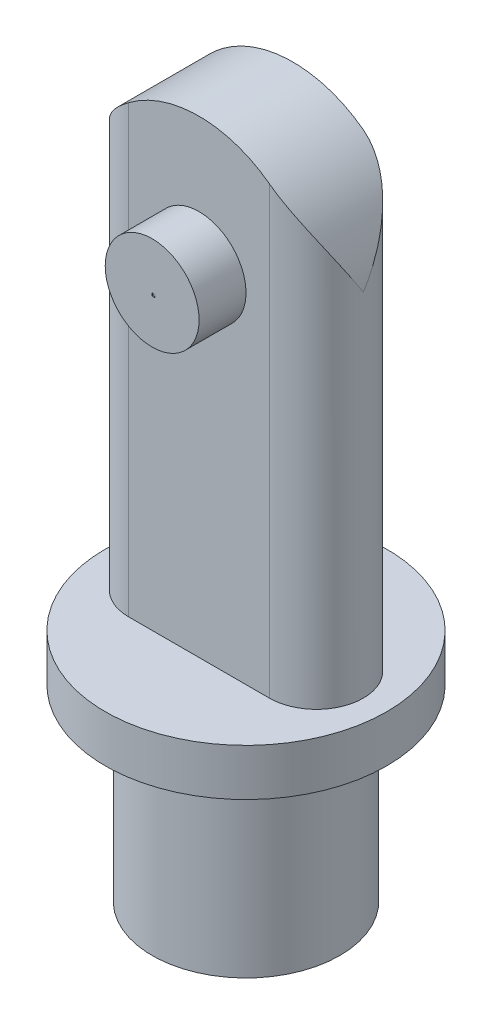
ISO-10303-21;
HEADER;
FILE_DESCRIPTION(('STEP AP214'),'2;1');
FILE_NAME('part.step','',(''),(''),'','','');
FILE_SCHEMA(('AUTOMOTIVE_DESIGN { 1 0 10303 214 1 1 1 1 }'));
ENDSEC;
DATA;
#1=APPLICATION_CONTEXT('core data for automotive mechanical design processes');
#2=APPLICATION_PROTOCOL_DEFINITION('international standard','automotive_design',2000,#1);
#3=PRODUCT_CONTEXT('',#1,'mechanical');
#4=PRODUCT('Part','Part','',(#3));
#5=PRODUCT_RELATED_PRODUCT_CATEGORY('part','',(#4));
#6=PRODUCT_DEFINITION_FORMATION('','',#4);
#7=PRODUCT_DEFINITION_CONTEXT('part definition',#1,'design');
#8=PRODUCT_DEFINITION('design','',#6,#7);
#9=PRODUCT_DEFINITION_SHAPE('','',#8);
#10=(LENGTH_UNIT() NAMED_UNIT(*) SI_UNIT(.MILLI.,.METRE.));
#11=(NAMED_UNIT(*) PLANE_ANGLE_UNIT() SI_UNIT($,.RADIAN.));
#12=(NAMED_UNIT(*) SI_UNIT($,.STERADIAN.) SOLID_ANGLE_UNIT());
#13=UNCERTAINTY_MEASURE_WITH_UNIT(LENGTH_MEASURE(1.E-05),#10,'distance_accuracy_value','');
#14=(GEOMETRIC_REPRESENTATION_CONTEXT(3) GLOBAL_UNCERTAINTY_ASSIGNED_CONTEXT((#13)) GLOBAL_UNIT_ASSIGNED_CONTEXT((#10,
#11,#12)) REPRESENTATION_CONTEXT('',''));
#15=CARTESIAN_POINT('',(0.,0.,0.));
#16=DIRECTION('',(0.,0.,1.));
#17=DIRECTION('',(1.,0.,0.));
#18=AXIS2_PLACEMENT_3D('',#15,#16,#17);
#19=CARTESIAN_POINT('',(-75.0000000000001,601.851851851852,-50.));
#20=DIRECTION('',(0.,0.,1.));
#21=DIRECTION('',(1.,0.,0.));
#22=AXIS2_PLACEMENT_3D('',#19,#20,#21);
#23=PLANE('',#22);
#24=DIRECTION('',(0.,-1.,0.));
#25=VECTOR('',#24,1.);
#26=CARTESIAN_POINT('',(-75.,601.851851851852,-50.));
#27=LINE('',#26,#25);
#28=CARTESIAN_POINT('',(-75.0000000000001,576.351851851852,-50.));
#29=VERTEX_POINT('',#28);
#30=CARTESIAN_POINT('',(-75.,101.851851851852,-50.));
#31=VERTEX_POINT('',#30);
#32=EDGE_CURVE('E217',#29,#31,#27,.T.);
#33=ORIENTED_EDGE('',*,*,#32,.F.);
#34=CARTESIAN_POINT('',(-1.66533453693773E-13,476.351851851852,-50.));
#35=DIRECTION('',(0.,0.,-1.));
#36=DIRECTION('',(1.,0.,0.));
#37=AXIS2_PLACEMENT_3D('',#34,#35,#36);
#38=CIRCLE('',#37,125.);
#39=CARTESIAN_POINT('',(75.,576.351851851852,-50.));
#40=VERTEX_POINT('',#39);
#41=EDGE_CURVE('E148',#29,#40,#38,.T.);
#42=ORIENTED_EDGE('',*,*,#41,.T.);
#43=DIRECTION('',(0.,-1.,0.));
#44=VECTOR('',#43,1.);
#45=CARTESIAN_POINT('',(74.9999999999999,601.851851851852,-50.));
#46=LINE('',#45,#44);
#47=CARTESIAN_POINT('',(75.,101.851851851852,-50.));
#48=VERTEX_POINT('',#47);
#49=EDGE_CURVE('E219',#40,#48,#46,.T.);
#50=ORIENTED_EDGE('',*,*,#49,.T.);
#51=DIRECTION('',(-1.,0.,0.));
#52=VECTOR('',#51,1.);
#53=CARTESIAN_POINT('',(-75.,101.851851851852,-50.));
#54=LINE('',#53,#52);
#55=EDGE_CURVE('E204',#48,#31,#54,.T.);
#56=ORIENTED_EDGE('',*,*,#55,.T.);
#57=EDGE_LOOP('',(#33,#42,#50,#56));
#58=FACE_BOUND('',#57,.T.);
#59=ADVANCED_FACE('F35',(#58),#23,.F.);
#60=CARTESIAN_POINT('',(-75.0000000000001,601.851851851852,50.));
#61=DIRECTION('',(0.,0.,-1.));
#62=DIRECTION('',(-1.,0.,0.));
#63=AXIS2_PLACEMENT_3D('',#60,#61,#62);
#64=PLANE('',#63);
#65=CARTESIAN_POINT('',(0.,463.3,50.));
#66=DIRECTION('',(0.,0.,-1.));
#67=DIRECTION('',(-1.,0.,0.));
#68=AXIS2_PLACEMENT_3D('',#65,#66,#67);
#69=CIRCLE('',#68,50.);
#70=CARTESIAN_POINT('',(-50.,463.3,50.));
#71=VERTEX_POINT('',#70);
#72=EDGE_CURVE('E11',#71,#71,#69,.F.);
#73=ORIENTED_EDGE('',*,*,#72,.F.);
#74=EDGE_LOOP('',(#73));
#75=FACE_BOUND('',#74,.T.);
#76=DIRECTION('',(0.,-1.,0.));
#77=VECTOR('',#76,1.);
#78=CARTESIAN_POINT('',(74.9999999999999,601.851851851852,50.));
#79=LINE('',#78,#77);
#80=CARTESIAN_POINT('',(75.,576.351851851852,50.));
#81=VERTEX_POINT('',#80);
#82=CARTESIAN_POINT('',(75.,101.851851851852,50.));
#83=VERTEX_POINT('',#82);
#84=EDGE_CURVE('E213',#81,#83,#79,.T.);
#85=ORIENTED_EDGE('',*,*,#84,.F.);
#86=CARTESIAN_POINT('',(-1.66533453693773E-13,476.351851851852,50.));
#87=DIRECTION('',(0.,0.,-1.));
#88=DIRECTION('',(1.,0.,0.));
#89=AXIS2_PLACEMENT_3D('',#86,#87,#88);
#90=CIRCLE('',#89,125.);
#91=CARTESIAN_POINT('',(-75.0000000000001,576.351851851852,50.));
#92=VERTEX_POINT('',#91);
#93=EDGE_CURVE('E147',#92,#81,#90,.T.);
#94=ORIENTED_EDGE('',*,*,#93,.F.);
#95=DIRECTION('',(0.,-1.,0.));
#96=VECTOR('',#95,1.);
#97=CARTESIAN_POINT('',(-75.0000000000001,601.851851851852,50.));
#98=LINE('',#97,#96);
#99=CARTESIAN_POINT('',(-75.,101.851851851852,50.));
#100=VERTEX_POINT('',#99);
#101=EDGE_CURVE('E215',#92,#100,#98,.T.);
#102=ORIENTED_EDGE('',*,*,#101,.T.);
#103=DIRECTION('',(1.,0.,0.));
#104=VECTOR('',#103,1.);
#105=CARTESIAN_POINT('',(-75.,101.851851851852,50.));
#106=LINE('',#105,#104);
#107=EDGE_CURVE('E210',#100,#83,#106,.T.);
#108=ORIENTED_EDGE('',*,*,#107,.T.);
#109=EDGE_LOOP('',(#85,#94,#102,#108));
#110=FACE_BOUND('',#109,.T.);
#111=ADVANCED_FACE('F176',(#75,#110),#64,.F.);
#112=CARTESIAN_POINT('',(0.,101.851851851852,0.));
#113=DIRECTION('',(0.,-1.,0.));
#114=DIRECTION('',(1.,0.,0.));
#115=AXIS2_PLACEMENT_3D('',#112,#113,#114);
#116=PLANE('',#115);
#117=CARTESIAN_POINT('',(0.,101.851851851852,0.));
#118=DIRECTION('',(0.,1.,0.));
#119=DIRECTION('',(-1.,0.,0.));
#120=AXIS2_PLACEMENT_3D('',#117,#118,#119);
#121=CIRCLE('',#120,150.);
#122=CARTESIAN_POINT('',(-150.,101.851851851852,0.));
#123=VERTEX_POINT('',#122);
#124=EDGE_CURVE('E221',#123,#123,#121,.T.);
#125=ORIENTED_EDGE('',*,*,#124,.T.);
#126=EDGE_LOOP('',(#125));
#127=FACE_BOUND('',#126,.T.);
#128=CARTESIAN_POINT('',(75.,101.851851851852,0.));
#129=DIRECTION('',(0.,1.,0.));
#130=DIRECTION('',(-1.,0.,0.));
#131=AXIS2_PLACEMENT_3D('',#128,#129,#130);
#132=CIRCLE('',#131,50.);
#133=EDGE_CURVE('E201',#83,#48,#132,.T.);
#134=ORIENTED_EDGE('',*,*,#133,.F.);
#135=ORIENTED_EDGE('',*,*,#107,.F.);
#136=CARTESIAN_POINT('',(-75.,101.851851851852,0.));
#137=DIRECTION('',(0.,1.,0.));
#138=DIRECTION('',(-1.,0.,0.));
#139=AXIS2_PLACEMENT_3D('',#136,#137,#138);
#140=CIRCLE('',#139,50.);
#141=EDGE_CURVE('E207',#31,#100,#140,.T.);
#142=ORIENTED_EDGE('',*,*,#141,.F.);
#143=ORIENTED_EDGE('',*,*,#55,.F.);
#144=EDGE_LOOP('',(#134,#135,#142,#143));
#145=FACE_BOUND('',#144,.T.);
#146=ADVANCED_FACE('F37',(#127,#145),#116,.F.);
#147=CARTESIAN_POINT('',(0.,-148.148148148148,0.));
#148=DIRECTION('',(0.,1.,0.));
#149=DIRECTION('',(-1.,0.,0.));
#150=AXIS2_PLACEMENT_3D('',#147,#148,#149);
#151=PLANE('',#150);
#152=CARTESIAN_POINT('',(0.,-148.148148148148,0.));
#153=DIRECTION('',(0.,1.,0.));
#154=DIRECTION('',(-1.,0.,0.));
#155=AXIS2_PLACEMENT_3D('',#152,#153,#154);
#156=CIRCLE('',#155,100.);
#157=CARTESIAN_POINT('',(-100.,-148.148148148148,0.));
#158=VERTEX_POINT('',#157);
#159=EDGE_CURVE('E43',#158,#158,#156,.T.);
#160=ORIENTED_EDGE('',*,*,#159,.F.);
#161=EDGE_LOOP('',(#160));
#162=FACE_BOUND('',#161,.T.);
#163=ADVANCED_FACE('F234',(#162),#151,.F.);
#164=CARTESIAN_POINT('',(0.,101.851851851852,0.));
#165=DIRECTION('',(0.,1.,0.));
#166=DIRECTION('',(-1.,0.,0.));
#167=AXIS2_PLACEMENT_3D('',#164,#165,#166);
#168=CYLINDRICAL_SURFACE('',#167,100.);
#169=CARTESIAN_POINT('',(0.,51.8518518518519,0.));
#170=DIRECTION('',(0.,1.,0.));
#171=DIRECTION('',(-1.,0.,0.));
#172=AXIS2_PLACEMENT_3D('',#169,#170,#171);
#173=CIRCLE('',#172,100.);
#174=CARTESIAN_POINT('',(-100.,51.8518518518519,0.));
#175=VERTEX_POINT('',#174);
#176=EDGE_CURVE('E227',#175,#175,#173,.T.);
#177=ORIENTED_EDGE('',*,*,#176,.F.);
#178=EDGE_LOOP('',(#177));
#179=FACE_BOUND('',#178,.T.);
#180=ORIENTED_EDGE('',*,*,#159,.T.);
#181=EDGE_LOOP('',(#180));
#182=FACE_BOUND('',#181,.T.);
#183=ADVANCED_FACE('F232',(#179,#182),#168,.T.);
#184=CARTESIAN_POINT('',(0.,51.8518518518519,0.));
#185=DIRECTION('',(0.,1.,0.));
#186=DIRECTION('',(-1.,0.,0.));
#187=AXIS2_PLACEMENT_3D('',#184,#185,#186);
#188=PLANE('',#187);
#189=CARTESIAN_POINT('',(0.,51.8518518518519,0.));
#190=DIRECTION('',(0.,1.,0.));
#191=DIRECTION('',(-1.,0.,0.));
#192=AXIS2_PLACEMENT_3D('',#189,#190,#191);
#193=CIRCLE('',#192,150.);
#194=CARTESIAN_POINT('',(-150.,51.8518518518519,0.));
#195=VERTEX_POINT('',#194);
#196=EDGE_CURVE('E224',#195,#195,#193,.T.);
#197=ORIENTED_EDGE('',*,*,#196,.F.);
#198=EDGE_LOOP('',(#197));
#199=FACE_BOUND('',#198,.T.);
#200=ORIENTED_EDGE('',*,*,#176,.T.);
#201=EDGE_LOOP('',(#200));
#202=FACE_BOUND('',#201,.T.);
#203=ADVANCED_FACE('F240',(#199,#202),#188,.F.);
#204=CARTESIAN_POINT('',(0.,101.851851851852,0.));
#205=DIRECTION('',(0.,1.,0.));
#206=DIRECTION('',(-1.,0.,0.));
#207=AXIS2_PLACEMENT_3D('',#204,#205,#206);
#208=CYLINDRICAL_SURFACE('',#207,150.);
#209=ORIENTED_EDGE('',*,*,#124,.F.);
#210=EDGE_LOOP('',(#209));
#211=FACE_BOUND('',#210,.T.);
#212=ORIENTED_EDGE('',*,*,#196,.T.);
#213=EDGE_LOOP('',(#212));
#214=FACE_BOUND('',#213,.T.);
#215=ADVANCED_FACE('F184',(#211,#214),#208,.T.);
#216=CARTESIAN_POINT('',(74.9999999999999,601.851851851852,0.));
#217=DIRECTION('',(0.,-1.,0.));
#218=DIRECTION('',(1.,0.,0.));
#219=AXIS2_PLACEMENT_3D('',#216,#217,#218);
#220=CYLINDRICAL_SURFACE('',#219,50.);
#221=ORIENTED_EDGE('',*,*,#49,.F.);
#222=CARTESIAN_POINT('',(74.9999999999999,576.351851851852,-50.));
#223=CARTESIAN_POINT('',(75.8548876916507,575.710722113704,-49.9999948188799));
#224=CARTESIAN_POINT('',(76.7014274211317,575.058654268094,-49.9780765631765));
#225=CARTESIAN_POINT('',(78.3760689163359,573.73423865997,-49.892935402162));
#226=CARTESIAN_POINT('',(79.2041749649826,573.061895695542,-49.8297221972158));
#227=CARTESIAN_POINT('',(80.8392312522473,571.699372628851,-49.664649470072));
#228=CARTESIAN_POINT('',(81.6462147883487,571.009224492328,-49.5628552487716));
#229=CARTESIAN_POINT('',(83.2393184013008,569.61137825138,-49.3230431476915));
#230=CARTESIAN_POINT('',(84.0254371597703,568.903679043396,-49.1850229848776));
#231=CARTESIAN_POINT('',(86.3361426340374,566.769968119452,-48.7231335746528));
#232=CARTESIAN_POINT('',(87.8290522518446,565.32000726162,-48.3497276675414));
#233=CARTESIAN_POINT('',(90.7250700647491,562.364910884924,-47.4869151179881));
#234=CARTESIAN_POINT('',(92.12812501792,560.859743469921,-46.9974404940054));
#235=CARTESIAN_POINT('',(94.4508996102789,558.242917214034,-46.0732408701906));
#236=CARTESIAN_POINT('',(95.3935241065153,557.142656923038,-45.6632914849911));
#237=CARTESIAN_POINT('',(97.2315765482262,554.92092440906,-44.7972015171445));
#238=CARTESIAN_POINT('',(98.1270003832501,553.799450350205,-44.341056921677));
#239=CARTESIAN_POINT('',(99.8707035667538,551.537504091322,-43.3870481282598));
#240=CARTESIAN_POINT('',(100.718974965325,550.397028729546,-42.8891769304691));
#241=CARTESIAN_POINT('',(102.368475154347,548.099293456338,-41.8558679971967));
#242=CARTESIAN_POINT('',(103.169704905388,546.942033888242,-41.3204310292979));
#243=CARTESIAN_POINT('',(104.729996272933,544.605878603508,-40.2125355116866));
#244=CARTESIAN_POINT('',(105.488791970012,543.426897237797,-39.6398836191794));
#245=CARTESIAN_POINT('',(106.959799421763,541.055393556719,-38.4637234241809));
#246=CARTESIAN_POINT('',(107.672011338206,539.862871288393,-37.8602152288557));
#247=CARTESIAN_POINT('',(109.050451126487,537.465766771549,-36.6254411262698));
#248=CARTESIAN_POINT('',(109.716680379267,536.261184886447,-35.9941760535299));
#249=CARTESIAN_POINT('',(111.003843506792,533.841199966037,-34.7066549266096));
#250=CARTESIAN_POINT('',(111.624775326797,532.62579644265,-34.0503977408124));
#251=CARTESIAN_POINT('',(113.070177723058,529.679438235681,-32.4387160224578));
#252=CARTESIAN_POINT('',(113.87231595725,527.943632790594,-31.4720514804099));
#253=CARTESIAN_POINT('',(115.389098466878,524.455626763471,-29.500304415542));
#254=CARTESIAN_POINT('',(116.103735360396,522.703424811573,-28.4952186607473));
#255=CARTESIAN_POINT('',(117.447486065346,519.184509399077,-26.4519686967095));
#256=CARTESIAN_POINT('',(118.07656345093,517.417790095221,-25.4137906295771));
#257=CARTESIAN_POINT('',(119.250401058601,513.872884008757,-23.3099332588211));
#258=CARTESIAN_POINT('',(119.795163641773,512.094697548718,-22.2442547262744));
#259=CARTESIAN_POINT('',(120.800792857726,508.532387475672,-20.092167793122));
#260=CARTESIAN_POINT('',(121.261826029635,506.748282997878,-19.0058053984205));
#261=CARTESIAN_POINT('',(122.102559806865,503.172338714624,-16.8144606164184));
#262=CARTESIAN_POINT('',(122.482258584527,501.380498736262,-15.7094778113012));
#263=CARTESIAN_POINT('',(123.161140751832,497.791692821242,-13.485387555063));
#264=CARTESIAN_POINT('',(123.460365987055,495.994730041599,-12.3662877628446));
#265=CARTESIAN_POINT('',(123.979339914542,492.396393621469,-10.1171219834834));
#266=CARTESIAN_POINT('',(124.1990939517,490.595020285824,-8.98705673908128));
#267=CARTESIAN_POINT('',(124.585601476667,486.730683380824,-6.55678689467915));
#268=CARTESIAN_POINT('',(124.740240814421,484.667239313518,-5.25541577054701));
#269=CARTESIAN_POINT('',(124.946904000051,480.539652669551,-2.64858068164321));
#270=CARTESIAN_POINT('',(124.998999059404,478.47551157395,-1.34312018816991));
#271=CARTESIAN_POINT('',(124.99999523736,476.391692782867,-0.0251976174018483));
#272=CARTESIAN_POINT('',(124.999999999237,476.371772305462,-0.0125988011475533));
#273=CARTESIAN_POINT('',(125.,476.351851851852,0.));
#274=B_SPLINE_CURVE_WITH_KNOTS('',3,(#222,#223,#224,#225,#226,#227,#228,#229,#230,#231,#232,
#233,#234,#235,#236,#237,#238,#239,#240,#241,#242,#243,#244,#245,#246,#247,#248,#249,#250,#251,
#252,#253,#254,#255,#256,#257,#258,#259,#260,#261,#262,#263,#264,#265,#266,#267,#268,#269,#270,
#271,#272,#273),.UNSPECIFIED.,.F.,.F.,(4,2,2,2,2,2,2,2,2,2,2,2,2,2,2,2,2,2,2,2,2,2,2,2,2,4),(0.,
3.20527938884933,6.40980611410545,9.60893301588431,12.808261581738,19.1444755624169,
25.4844098752057,29.9999920654819,34.5159668459693,39.0327007254524,43.5493423411897,
48.0916873504894,52.6340165849582,57.176209345869,61.7186080176362,68.1440747392081,
74.5700831626554,80.9988188687545,87.4273745170106,93.8430001795978,100.258769992229,
106.671197178534,113.083193012112,120.414389720974,127.740493509952,127.811204189514),.UNSPECIFIED.);
#275=CARTESIAN_POINT('',(125.,476.351851851852,0.));
#276=VERTEX_POINT('',#275);
#277=EDGE_CURVE('E194',#40,#276,#274,.T.);
#278=ORIENTED_EDGE('',*,*,#277,.T.);
#279=CARTESIAN_POINT('',(74.9999999999999,576.351851851852,50.));
#280=CARTESIAN_POINT('',(75.8548876916507,575.710722113704,49.9999948188799));
#281=CARTESIAN_POINT('',(76.7014274211316,575.058654268094,49.9780765631765));
#282=CARTESIAN_POINT('',(78.3760689163358,573.73423865997,49.892935402162));
#283=CARTESIAN_POINT('',(79.2041749649825,573.061895695542,49.8297221972158));
#284=CARTESIAN_POINT('',(80.8392312522472,571.699372628851,49.664649470072));
#285=CARTESIAN_POINT('',(81.6462147883487,571.009224492328,49.5628552487716));
#286=CARTESIAN_POINT('',(83.2393184013009,569.61137825138,49.3230431476915));
#287=CARTESIAN_POINT('',(84.0254371597704,568.903679043396,49.1850229848776));
#288=CARTESIAN_POINT('',(86.3361426340374,566.769968119452,48.7231335746528));
#289=CARTESIAN_POINT('',(87.8290522518446,565.32000726162,48.3497276675414));
#290=CARTESIAN_POINT('',(90.7250700647491,562.364910884924,47.4869151179881));
#291=CARTESIAN_POINT('',(92.12812501792,560.859743469921,46.9974404940054));
#292=CARTESIAN_POINT('',(94.4508996102789,558.242917214034,46.0732408701906));
#293=CARTESIAN_POINT('',(95.3935241065153,557.142656923038,45.6632914849911));
#294=CARTESIAN_POINT('',(97.2315765482262,554.92092440906,44.7972015171445));
#295=CARTESIAN_POINT('',(98.12700038325,553.799450350205,44.341056921677));
#296=CARTESIAN_POINT('',(99.8707035667538,551.537504091322,43.3870481282598));
#297=CARTESIAN_POINT('',(100.718974965325,550.397028729546,42.8891769304691));
#298=CARTESIAN_POINT('',(102.368475154347,548.099293456338,41.8558679971967));
#299=CARTESIAN_POINT('',(103.169704905388,546.942033888242,41.3204310292979));
#300=CARTESIAN_POINT('',(104.729996272933,544.605878603508,40.2125355116866));
#301=CARTESIAN_POINT('',(105.488791970012,543.426897237797,39.6398836191794));
#302=CARTESIAN_POINT('',(106.959799421763,541.055393556719,38.4637234241809));
#303=CARTESIAN_POINT('',(107.672011338206,539.862871288393,37.8602152288557));
#304=CARTESIAN_POINT('',(109.050451126487,537.465766771549,36.6254411262698));
#305=CARTESIAN_POINT('',(109.716680379267,536.261184886447,35.9941760535299));
#306=CARTESIAN_POINT('',(111.003843506792,533.841199966037,34.7066549266096));
#307=CARTESIAN_POINT('',(111.624775326797,532.62579644265,34.0503977408124));
#308=CARTESIAN_POINT('',(113.070177723058,529.679438235681,32.4387160224578));
#309=CARTESIAN_POINT('',(113.87231595725,527.943632790594,31.4720514804099));
#310=CARTESIAN_POINT('',(115.389098466878,524.455626763471,29.500304415542));
#311=CARTESIAN_POINT('',(116.103735360396,522.703424811573,28.4952186607473));
#312=CARTESIAN_POINT('',(117.447486065346,519.184509399077,26.4519686967095));
#313=CARTESIAN_POINT('',(118.07656345093,517.417790095221,25.4137906295771));
#314=CARTESIAN_POINT('',(119.250401058601,513.872884008757,23.3099332588211));
#315=CARTESIAN_POINT('',(119.795163641773,512.094697548718,22.2442547262744));
#316=CARTESIAN_POINT('',(120.800792857726,508.532387475672,20.092167793122));
#317=CARTESIAN_POINT('',(121.261826029635,506.748282997878,19.0058053984205));
#318=CARTESIAN_POINT('',(122.102559806865,503.172338714624,16.8144606164184));
#319=CARTESIAN_POINT('',(122.482258584527,501.380498736262,15.7094778113012));
#320=CARTESIAN_POINT('',(123.161140751832,497.791692821242,13.485387555063));
#321=CARTESIAN_POINT('',(123.460365987055,495.994730041599,12.3662877628446));
#322=CARTESIAN_POINT('',(123.979339914542,492.396393621469,10.1171219834834));
#323=CARTESIAN_POINT('',(124.1990939517,490.595020285824,8.98705673908128));
#324=CARTESIAN_POINT('',(124.585601476667,486.730683380824,6.55678689467915));
#325=CARTESIAN_POINT('',(124.740240814421,484.667239313518,5.25541577054701));
#326=CARTESIAN_POINT('',(124.946904000051,480.539652669551,2.64858068164321));
#327=CARTESIAN_POINT('',(124.998999059404,478.47551157395,1.34312018816991));
#328=CARTESIAN_POINT('',(124.99999523736,476.391692782867,0.0251976174018483));
#329=CARTESIAN_POINT('',(124.999999999237,476.371772305462,0.0125988011475533));
#330=CARTESIAN_POINT('',(125.,476.351851851852,0.));
#331=B_SPLINE_CURVE_WITH_KNOTS('',3,(#279,#280,#281,#282,#283,#284,#285,#286,#287,#288,#289,
#290,#291,#292,#293,#294,#295,#296,#297,#298,#299,#300,#301,#302,#303,#304,#305,#306,#307,#308,
#309,#310,#311,#312,#313,#314,#315,#316,#317,#318,#319,#320,#321,#322,#323,#324,#325,#326,#327,
#328,#329,#330),.UNSPECIFIED.,.F.,.F.,(4,2,2,2,2,2,2,2,2,2,2,2,2,2,2,2,2,2,2,2,2,2,2,2,2,4),(0.,
3.20527938884929,6.40980611410538,9.60893301588433,12.808261581738,19.144475562417,
25.4844098752057,29.9999920654819,34.5159668459693,39.0327007254524,43.5493423411897,
48.0916873504894,52.6340165849582,57.176209345869,61.7186080176362,68.1440747392081,
74.5700831626554,80.9988188687544,87.4273745170106,93.8430001795978,100.258769992229,
106.671197178534,113.083193012112,120.414389720974,127.740493509952,127.811204189514),.UNSPECIFIED.);
#332=EDGE_CURVE('E188',#276,#81,#331,.F.);
#333=ORIENTED_EDGE('',*,*,#332,.T.);
#334=ORIENTED_EDGE('',*,*,#84,.T.);
#335=ORIENTED_EDGE('',*,*,#133,.T.);
#336=EDGE_LOOP('',(#221,#278,#333,#334,#335));
#337=FACE_BOUND('',#336,.T.);
#338=ADVANCED_FACE('F174',(#337),#220,.T.);
#339=CARTESIAN_POINT('',(-75.0000000000001,601.851851851852,0.));
#340=DIRECTION('',(0.,-1.,0.));
#341=DIRECTION('',(1.,0.,0.));
#342=AXIS2_PLACEMENT_3D('',#339,#340,#341);
#343=CYLINDRICAL_SURFACE('',#342,50.);
#344=ORIENTED_EDGE('',*,*,#101,.F.);
#345=CARTESIAN_POINT('',(-75.0000000000001,576.351851851852,50.));
#346=CARTESIAN_POINT('',(-75.8548876916703,575.71072211369,49.9999948188799));
#347=CARTESIAN_POINT('',(-76.7014274211702,575.058654268064,49.9780765631755));
#348=CARTESIAN_POINT('',(-78.3760689164117,573.734238659909,49.8929354021572));
#349=CARTESIAN_POINT('',(-79.2041749650765,573.061895695465,49.8297221972082));
#350=CARTESIAN_POINT('',(-80.8392312523763,571.699372628742,49.6646494700571));
#351=CARTESIAN_POINT('',(-81.6462147884946,571.009224492203,49.5628552487523));
#352=CARTESIAN_POINT('',(-83.2393184014795,569.611378251221,49.323043147662));
#353=CARTESIAN_POINT('',(-84.0254371599649,568.90367904322,49.1850229848422));
#354=CARTESIAN_POINT('',(-86.3361426342083,566.769968119288,48.7231335746119));
#355=CARTESIAN_POINT('',(-87.8290522519782,565.320007261487,48.3497276675048));
#356=CARTESIAN_POINT('',(-90.7250700648127,562.364910884856,47.4869151179659));
#357=CARTESIAN_POINT('',(-92.1281250179508,560.859743469886,46.9974404939931));
#358=CARTESIAN_POINT('',(-94.450899610267,558.242917214048,46.0732408701954));
#359=CARTESIAN_POINT('',(-95.393524106492,557.142656923065,45.6632914850013));
#360=CARTESIAN_POINT('',(-97.2315765481813,554.920924409116,44.7972015171665));
#361=CARTESIAN_POINT('',(-98.1270003831949,553.799450350275,44.3410569217056));
#362=CARTESIAN_POINT('',(-99.8707035666788,551.537504091421,43.3870481283025));
#363=CARTESIAN_POINT('',(-100.718974965241,550.397028729661,42.8891769305195));
#364=CARTESIAN_POINT('',(-102.368475154245,548.099293456484,41.8558679972633));
#365=CARTESIAN_POINT('',(-103.169704905278,546.942033888404,41.320431029373));
#366=CARTESIAN_POINT('',(-104.729996272827,544.605878603672,40.2125355117656));
#367=CARTESIAN_POINT('',(-105.488791969917,543.426897237947,39.639883619253));
#368=CARTESIAN_POINT('',(-106.959799421689,541.055393556842,38.4637234242428));
#369=CARTESIAN_POINT('',(-107.672011338142,539.862871288502,37.8602152289114));
#370=CARTESIAN_POINT('',(-109.050451126443,537.465766771629,36.6254411263114));
#371=CARTESIAN_POINT('',(-109.716680379232,536.261184886512,35.9941760535636));
#372=CARTESIAN_POINT('',(-111.003843506776,533.84119996607,34.706654926627));
#373=CARTESIAN_POINT('',(-111.624775326789,532.625796442667,34.0503977408212));
#374=CARTESIAN_POINT('',(-113.070177723067,529.679438235664,32.4387160224482));
#375=CARTESIAN_POINT('',(-113.872315957266,527.943632790558,31.4720514803901));
#376=CARTESIAN_POINT('',(-115.389098466909,524.4556267634,29.5003044155012));
#377=CARTESIAN_POINT('',(-116.103735360433,522.703424811485,28.4952186606957));
#378=CARTESIAN_POINT('',(-117.447486065391,519.184509398957,26.4519686966389));
#379=CARTESIAN_POINT('',(-118.076563450977,517.417790095087,25.4137906294983));
#380=CARTESIAN_POINT('',(-119.250401058652,513.872884008595,23.3099332587232));
#381=CARTESIAN_POINT('',(-119.795163641826,512.094697548543,22.2442547261655));
#382=CARTESIAN_POINT('',(-120.800792857773,508.532387475496,20.092167793018));
#383=CARTESIAN_POINT('',(-121.261826029674,506.748282997716,19.0058053983328));
#384=CARTESIAN_POINT('',(-122.102559806892,503.172338714508,16.8144606163347));
#385=CARTESIAN_POINT('',(-122.482258584548,501.38049873618,15.7094778112053));
#386=CARTESIAN_POINT('',(-123.161140751844,497.791692821154,13.4853875550521));
#387=CARTESIAN_POINT('',(-123.460365987063,495.99473004147,12.3662877629309));
#388=CARTESIAN_POINT('',(-123.979339914545,492.39639362152,10.1171219833468));
#389=CARTESIAN_POINT('',(-124.199093951701,490.595020286096,8.98705673862461));
#390=CARTESIAN_POINT('',(-124.585601476667,486.730683380503,6.55678689519211));
#391=CARTESIAN_POINT('',(-124.740240814421,484.667239312233,5.25541577258816));
#392=CARTESIAN_POINT('',(-124.946904000051,480.539652670846,2.64858067960428));
#393=CARTESIAN_POINT('',(-124.998999059405,478.475511578786,1.34312018052764));
#394=CARTESIAN_POINT('',(-124.99999523736,476.39169278296,0.0251976172548661));
#395=CARTESIAN_POINT('',(-124.999999999237,476.371772305509,0.0125988010734479));
#396=CARTESIAN_POINT('',(-125.,476.351851851852,0.));
#397=B_SPLINE_CURVE_WITH_KNOTS('',3,(#345,#346,#347,#348,#349,#350,#351,#352,#353,#354,#355,
#356,#357,#358,#359,#360,#361,#362,#363,#364,#365,#366,#367,#368,#369,#370,#371,#372,#373,#374,
#375,#376,#377,#378,#379,#380,#381,#382,#383,#384,#385,#386,#387,#388,#389,#390,#391,#392,#393,
#394,#395,#396),.UNSPECIFIED.,.F.,.F.,(4,2,2,2,2,2,2,2,2,2,2,2,2,2,2,2,2,2,2,2,2,2,2,2,2,4),(0.,
3.20527938892213,6.40980611425107,9.60893301610141,12.8082615820264,19.1444755625606,
25.4844098752058,29.9999920654259,34.5159668458572,39.0327007252819,43.5493423409609,
48.0916873503149,52.6340165848381,57.1762093458088,61.718608017636,68.1440747392741,
74.570083162786,80.9988188689336,87.4273745172409,93.8430001797652,100.258769992329,
106.671197178579,113.08319301211,120.414389720968,127.740493509952,127.811204189514),.UNSPECIFIED.);
#398=CARTESIAN_POINT('',(-125.,476.351851851852,0.));
#399=VERTEX_POINT('',#398);
#400=EDGE_CURVE('E58',#92,#399,#397,.T.);
#401=ORIENTED_EDGE('',*,*,#400,.T.);
#402=CARTESIAN_POINT('',(-75.0000000000001,576.351851851852,-50.));
#403=CARTESIAN_POINT('',(-75.8548876916703,575.71072211369,-49.9999948188799));
#404=CARTESIAN_POINT('',(-76.7014274211702,575.058654268064,-49.9780765631755));
#405=CARTESIAN_POINT('',(-78.3760689164117,573.734238659909,-49.8929354021572));
#406=CARTESIAN_POINT('',(-79.2041749650765,573.061895695465,-49.8297221972082));
#407=CARTESIAN_POINT('',(-80.8392312523763,571.699372628742,-49.6646494700571));
#408=CARTESIAN_POINT('',(-81.6462147884946,571.009224492203,-49.5628552487523));
#409=CARTESIAN_POINT('',(-83.2393184014795,569.611378251221,-49.323043147662));
#410=CARTESIAN_POINT('',(-84.0254371599649,568.90367904322,-49.1850229848422));
#411=CARTESIAN_POINT('',(-86.3361426342083,566.769968119288,-48.7231335746119));
#412=CARTESIAN_POINT('',(-87.8290522519782,565.320007261487,-48.3497276675048));
#413=CARTESIAN_POINT('',(-90.7250700648127,562.364910884856,-47.4869151179659));
#414=CARTESIAN_POINT('',(-92.1281250179508,560.859743469886,-46.9974404939931));
#415=CARTESIAN_POINT('',(-94.450899610267,558.242917214048,-46.0732408701954));
#416=CARTESIAN_POINT('',(-95.393524106492,557.142656923065,-45.6632914850013));
#417=CARTESIAN_POINT('',(-97.2315765481813,554.920924409116,-44.7972015171665));
#418=CARTESIAN_POINT('',(-98.1270003831949,553.799450350275,-44.3410569217056));
#419=CARTESIAN_POINT('',(-99.8707035666788,551.537504091421,-43.3870481283025));
#420=CARTESIAN_POINT('',(-100.718974965241,550.397028729661,-42.8891769305195));
#421=CARTESIAN_POINT('',(-102.368475154245,548.099293456484,-41.8558679972633));
#422=CARTESIAN_POINT('',(-103.169704905278,546.942033888404,-41.320431029373));
#423=CARTESIAN_POINT('',(-104.729996272827,544.605878603672,-40.2125355117656));
#424=CARTESIAN_POINT('',(-105.488791969917,543.426897237947,-39.639883619253));
#425=CARTESIAN_POINT('',(-106.959799421689,541.055393556842,-38.4637234242428));
#426=CARTESIAN_POINT('',(-107.672011338142,539.862871288502,-37.8602152289114));
#427=CARTESIAN_POINT('',(-109.050451126443,537.465766771629,-36.6254411263114));
#428=CARTESIAN_POINT('',(-109.716680379232,536.261184886512,-35.9941760535636));
#429=CARTESIAN_POINT('',(-111.003843506776,533.84119996607,-34.706654926627));
#430=CARTESIAN_POINT('',(-111.624775326789,532.625796442667,-34.0503977408212));
#431=CARTESIAN_POINT('',(-113.070177723067,529.679438235664,-32.4387160224482));
#432=CARTESIAN_POINT('',(-113.872315957266,527.943632790558,-31.4720514803901));
#433=CARTESIAN_POINT('',(-115.389098466909,524.4556267634,-29.5003044155012));
#434=CARTESIAN_POINT('',(-116.103735360433,522.703424811485,-28.4952186606957));
#435=CARTESIAN_POINT('',(-117.447486065391,519.184509398957,-26.4519686966389));
#436=CARTESIAN_POINT('',(-118.076563450977,517.417790095087,-25.4137906294983));
#437=CARTESIAN_POINT('',(-119.250401058652,513.872884008595,-23.3099332587232));
#438=CARTESIAN_POINT('',(-119.795163641826,512.094697548543,-22.2442547261655));
#439=CARTESIAN_POINT('',(-120.800792857773,508.532387475496,-20.092167793018));
#440=CARTESIAN_POINT('',(-121.261826029674,506.748282997716,-19.0058053983328));
#441=CARTESIAN_POINT('',(-122.102559806892,503.172338714508,-16.8144606163347));
#442=CARTESIAN_POINT('',(-122.482258584548,501.38049873618,-15.7094778112053));
#443=CARTESIAN_POINT('',(-123.161140751844,497.791692821154,-13.4853875550521));
#444=CARTESIAN_POINT('',(-123.460365987063,495.99473004147,-12.3662877629309));
#445=CARTESIAN_POINT('',(-123.979339914545,492.39639362152,-10.1171219833468));
#446=CARTESIAN_POINT('',(-124.199093951701,490.595020286096,-8.98705673862461));
#447=CARTESIAN_POINT('',(-124.585601476667,486.730683380503,-6.55678689519211));
#448=CARTESIAN_POINT('',(-124.740240814421,484.667239312233,-5.25541577258816));
#449=CARTESIAN_POINT('',(-124.946904000051,480.539652670846,-2.64858067960428));
#450=CARTESIAN_POINT('',(-124.998999059405,478.475511578786,-1.34312018052764));
#451=CARTESIAN_POINT('',(-124.99999523736,476.39169278296,-0.0251976172548661));
#452=CARTESIAN_POINT('',(-124.999999999237,476.371772305509,-0.0125988010734479));
#453=CARTESIAN_POINT('',(-125.,476.351851851852,0.));
#454=B_SPLINE_CURVE_WITH_KNOTS('',3,(#402,#403,#404,#405,#406,#407,#408,#409,#410,#411,#412,
#413,#414,#415,#416,#417,#418,#419,#420,#421,#422,#423,#424,#425,#426,#427,#428,#429,#430,#431,
#432,#433,#434,#435,#436,#437,#438,#439,#440,#441,#442,#443,#444,#445,#446,#447,#448,#449,#450,
#451,#452,#453),.UNSPECIFIED.,.F.,.F.,(4,2,2,2,2,2,2,2,2,2,2,2,2,2,2,2,2,2,2,2,2,2,2,2,2,4),(0.,
3.20527938892213,6.40980611425107,9.60893301610141,12.8082615820264,19.1444755625606,
25.4844098752058,29.9999920654259,34.5159668458572,39.0327007252819,43.5493423409609,
48.0916873503149,52.6340165848381,57.1762093458088,61.718608017636,68.1440747392741,
74.570083162786,80.9988188689336,87.4273745172409,93.8430001797652,100.258769992329,
106.671197178579,113.08319301211,120.414389720968,127.740493509952,127.811204189514),.UNSPECIFIED.);
#455=EDGE_CURVE('E151',#399,#29,#454,.F.);
#456=ORIENTED_EDGE('',*,*,#455,.T.);
#457=ORIENTED_EDGE('',*,*,#32,.T.);
#458=ORIENTED_EDGE('',*,*,#141,.T.);
#459=EDGE_LOOP('',(#344,#401,#456,#457,#458));
#460=FACE_BOUND('',#459,.T.);
#461=ADVANCED_FACE('F170',(#460),#343,.T.);
#462=CARTESIAN_POINT('',(-1.66533453693773E-13,476.351851851852,-50.));
#463=DIRECTION('',(0.,0.,1.));
#464=DIRECTION('',(1.,0.,0.));
#465=AXIS2_PLACEMENT_3D('',#462,#463,#464);
#466=CYLINDRICAL_SURFACE('',#465,125.);
#467=ORIENTED_EDGE('',*,*,#41,.F.);
#468=ORIENTED_EDGE('',*,*,#455,.F.);
#469=ORIENTED_EDGE('',*,*,#400,.F.);
#470=ORIENTED_EDGE('',*,*,#93,.T.);
#471=ORIENTED_EDGE('',*,*,#332,.F.);
#472=ORIENTED_EDGE('',*,*,#277,.F.);
#473=EDGE_LOOP('',(#467,#468,#469,#470,#471,#472));
#474=FACE_BOUND('',#473,.T.);
#475=ADVANCED_FACE('F166',(#474),#466,.T.);
#476=CARTESIAN_POINT('',(0.,463.3,100.));
#477=DIRECTION('',(0.,0.,-1.));
#478=DIRECTION('',(-1.,0.,0.));
#479=AXIS2_PLACEMENT_3D('',#476,#477,#478);
#480=CYLINDRICAL_SURFACE('',#479,50.);
#481=CARTESIAN_POINT('',(0.,463.3,100.));
#482=DIRECTION('',(0.,0.,1.));
#483=DIRECTION('',(1.,0.,0.));
#484=AXIS2_PLACEMENT_3D('',#481,#482,#483);
#485=CIRCLE('',#484,50.);
#486=CARTESIAN_POINT('',(50.,463.3,100.));
#487=VERTEX_POINT('',#486);
#488=EDGE_CURVE('E141',#487,#487,#485,.T.);
#489=ORIENTED_EDGE('',*,*,#488,.F.);
#490=EDGE_LOOP('',(#489));
#491=FACE_BOUND('',#490,.T.);
#492=ORIENTED_EDGE('',*,*,#72,.T.);
#493=EDGE_LOOP('',(#492));
#494=FACE_BOUND('',#493,.T.);
#495=ADVANCED_FACE('F269',(#491,#494),#480,.T.);
#496=CARTESIAN_POINT('',(0.,463.3,100.));
#497=DIRECTION('',(0.,0.,1.));
#498=DIRECTION('',(1.,0.,0.));
#499=AXIS2_PLACEMENT_3D('',#496,#497,#498);
#500=PLANE('',#499);
#501=DIRECTION('',(0.,-1.,0.));
#502=VECTOR('',#501,1.);
#503=CARTESIAN_POINT('',(0.,463.3,100.));
#504=LINE('',#503,#502);
#505=CARTESIAN_POINT('',(0.,463.3,100.));
#506=VERTEX_POINT('',#505);
#507=CARTESIAN_POINT('',(0.,460.30686495362,100.));
#508=VERTEX_POINT('',#507);
#509=EDGE_CURVE('E50',#506,#508,#504,.T.);
#510=ORIENTED_EDGE('',*,*,#509,.F.);
#511=DIRECTION('',(-1.,0.,0.));
#512=VECTOR('',#511,1.);
#513=CARTESIAN_POINT('',(0.,463.3,100.));
#514=LINE('',#513,#512);
#515=CARTESIAN_POINT('',(3.09043262769329,463.3,100.));
#516=VERTEX_POINT('',#515);
#517=EDGE_CURVE('E126',#516,#506,#514,.T.);
#518=ORIENTED_EDGE('',*,*,#517,.F.);
#519=DIRECTION('',(0.,1.,0.));
#520=VECTOR('',#519,1.);
#521=CARTESIAN_POINT('',(3.09043262769329,463.3,100.));
#522=LINE('',#521,#520);
#523=CARTESIAN_POINT('',(3.09043262769329,460.30686495362,100.));
#524=VERTEX_POINT('',#523);
#525=EDGE_CURVE('E129',#524,#516,#522,.T.);
#526=ORIENTED_EDGE('',*,*,#525,.F.);
#527=DIRECTION('',(1.,0.,0.));
#528=VECTOR('',#527,1.);
#529=CARTESIAN_POINT('',(0.,460.30686495362,100.));
#530=LINE('',#529,#528);
#531=EDGE_CURVE('E135',#508,#524,#530,.T.);
#532=ORIENTED_EDGE('',*,*,#531,.F.);
#533=EDGE_LOOP('',(#510,#518,#526,#532));
#534=FACE_BOUND('',#533,.T.);
#535=ORIENTED_EDGE('',*,*,#488,.T.);
#536=EDGE_LOOP('',(#535));
#537=FACE_BOUND('',#536,.T.);
#538=ADVANCED_FACE('F273',(#534,#537),#500,.T.);
#539=CARTESIAN_POINT('',(0.,463.3,99.));
#540=DIRECTION('',(-1.,0.,0.));
#541=DIRECTION('',(0.,0.,1.));
#542=AXIS2_PLACEMENT_3D('',#539,#540,#541);
#543=PLANE('',#542);
#544=ORIENTED_EDGE('',*,*,#509,.T.);
#545=DIRECTION('',(0.,0.,1.));
#546=VECTOR('',#545,1.);
#547=CARTESIAN_POINT('',(0.,460.30686495362,99.));
#548=LINE('',#547,#546);
#549=CARTESIAN_POINT('',(0.,460.30686495362,99.));
#550=VERTEX_POINT('',#549);
#551=EDGE_CURVE('E104',#550,#508,#548,.T.);
#552=ORIENTED_EDGE('',*,*,#551,.F.);
#553=DIRECTION('',(0.,-1.,0.));
#554=VECTOR('',#553,1.);
#555=CARTESIAN_POINT('',(0.,463.3,99.));
#556=LINE('',#555,#554);
#557=CARTESIAN_POINT('',(0.,463.3,99.));
#558=VERTEX_POINT('',#557);
#559=EDGE_CURVE('E108',#558,#550,#556,.T.);
#560=ORIENTED_EDGE('',*,*,#559,.F.);
#561=DIRECTION('',(0.,0.,1.));
#562=VECTOR('',#561,1.);
#563=CARTESIAN_POINT('',(0.,463.3,99.));
#564=LINE('',#563,#562);
#565=EDGE_CURVE('E139',#558,#506,#564,.T.);
#566=ORIENTED_EDGE('',*,*,#565,.T.);
#567=EDGE_LOOP('',(#544,#552,#560,#566));
#568=FACE_BOUND('',#567,.T.);
#569=ADVANCED_FACE('F106',(#568),#543,.F.);
#570=CARTESIAN_POINT('',(0.,463.3,99.));
#571=DIRECTION('',(0.,1.,0.));
#572=DIRECTION('',(0.,0.,1.));
#573=AXIS2_PLACEMENT_3D('',#570,#571,#572);
#574=PLANE('',#573);
#575=ORIENTED_EDGE('',*,*,#517,.T.);
#576=ORIENTED_EDGE('',*,*,#565,.F.);
#577=DIRECTION('',(-1.,0.,0.));
#578=VECTOR('',#577,1.);
#579=CARTESIAN_POINT('',(0.,463.3,99.));
#580=LINE('',#579,#578);
#581=CARTESIAN_POINT('',(3.09043262769329,463.3,99.));
#582=VERTEX_POINT('',#581);
#583=EDGE_CURVE('E114',#582,#558,#580,.T.);
#584=ORIENTED_EDGE('',*,*,#583,.F.);
#585=DIRECTION('',(0.,0.,1.));
#586=VECTOR('',#585,1.);
#587=CARTESIAN_POINT('',(3.09043262769329,463.3,99.));
#588=LINE('',#587,#586);
#589=EDGE_CURVE('E142',#582,#516,#588,.T.);
#590=ORIENTED_EDGE('',*,*,#589,.T.);
#591=EDGE_LOOP('',(#575,#576,#584,#590));
#592=FACE_BOUND('',#591,.T.);
#593=ADVANCED_FACE('F286',(#592),#574,.F.);
#594=CARTESIAN_POINT('',(3.09043262769329,463.3,99.));
#595=DIRECTION('',(1.,0.,0.));
#596=DIRECTION('',(0.,0.,-1.));
#597=AXIS2_PLACEMENT_3D('',#594,#595,#596);
#598=PLANE('',#597);
#599=ORIENTED_EDGE('',*,*,#525,.T.);
#600=ORIENTED_EDGE('',*,*,#589,.F.);
#601=DIRECTION('',(0.,1.,0.));
#602=VECTOR('',#601,1.);
#603=CARTESIAN_POINT('',(3.09043262769329,463.3,99.));
#604=LINE('',#603,#602);
#605=CARTESIAN_POINT('',(3.09043262769329,460.30686495362,99.));
#606=VERTEX_POINT('',#605);
#607=EDGE_CURVE('E122',#606,#582,#604,.T.);
#608=ORIENTED_EDGE('',*,*,#607,.F.);
#609=DIRECTION('',(0.,0.,1.));
#610=VECTOR('',#609,1.);
#611=CARTESIAN_POINT('',(3.09043262769329,460.30686495362,99.));
#612=LINE('',#611,#610);
#613=EDGE_CURVE('E113',#606,#524,#612,.T.);
#614=ORIENTED_EDGE('',*,*,#613,.T.);
#615=EDGE_LOOP('',(#599,#600,#608,#614));
#616=FACE_BOUND('',#615,.T.);
#617=ADVANCED_FACE('F289',(#616),#598,.F.);
#618=CARTESIAN_POINT('',(0.,460.30686495362,99.));
#619=DIRECTION('',(0.,-1.,0.));
#620=DIRECTION('',(0.,0.,-1.));
#621=AXIS2_PLACEMENT_3D('',#618,#619,#620);
#622=PLANE('',#621);
#623=ORIENTED_EDGE('',*,*,#531,.T.);
#624=ORIENTED_EDGE('',*,*,#613,.F.);
#625=DIRECTION('',(1.,0.,0.));
#626=VECTOR('',#625,1.);
#627=CARTESIAN_POINT('',(0.,460.30686495362,99.));
#628=LINE('',#627,#626);
#629=EDGE_CURVE('E117',#550,#606,#628,.T.);
#630=ORIENTED_EDGE('',*,*,#629,.F.);
#631=ORIENTED_EDGE('',*,*,#551,.T.);
#632=EDGE_LOOP('',(#623,#624,#630,#631));
#633=FACE_BOUND('',#632,.T.);
#634=ADVANCED_FACE('F118',(#633),#622,.F.);
#635=CARTESIAN_POINT('',(0.,0.,99.));
#636=DIRECTION('',(0.,0.,1.));
#637=DIRECTION('',(1.,0.,0.));
#638=AXIS2_PLACEMENT_3D('',#635,#636,#637);
#639=PLANE('',#638);
#640=ORIENTED_EDGE('',*,*,#559,.T.);
#641=ORIENTED_EDGE('',*,*,#629,.T.);
#642=ORIENTED_EDGE('',*,*,#607,.T.);
#643=ORIENTED_EDGE('',*,*,#583,.T.);
#644=EDGE_LOOP('',(#640,#641,#642,#643));
#645=FACE_BOUND('',#644,.T.);
#646=ADVANCED_FACE('F124',(#645),#639,.T.);
#647=CLOSED_SHELL('',(#59,#111,#146,#163,#183,#203,#215,#338,#461,#475,#495,#538,#569,#593,#617,
#634,#646));
#648=MANIFOLD_SOLID_BREP('B2',#647);
#649=ADVANCED_BREP_SHAPE_REPRESENTATION('',(#18,#648),#14);
#650=SHAPE_DEFINITION_REPRESENTATION(#9,#649);
ENDSEC;
END-ISO-10303-21;
